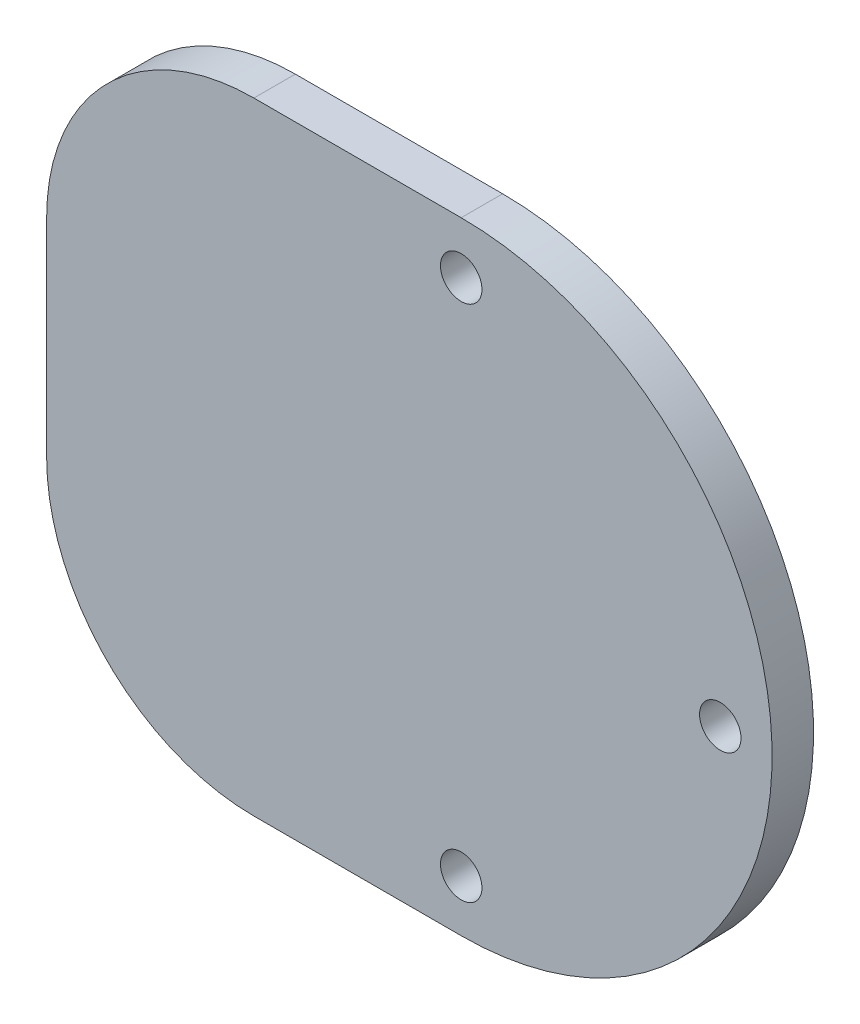
ISO-10303-21;
HEADER;
FILE_DESCRIPTION(('STEP AP214'),'2;1');
FILE_NAME('part.step','',(''),(''),'','','');
FILE_SCHEMA(('AUTOMOTIVE_DESIGN { 1 0 10303 214 1 1 1 1 }'));
ENDSEC;
DATA;
#1=APPLICATION_CONTEXT('core data for automotive mechanical design processes');
#2=APPLICATION_PROTOCOL_DEFINITION('international standard','automotive_design',2000,#1);
#3=PRODUCT_CONTEXT('',#1,'mechanical');
#4=PRODUCT('Part','Part','',(#3));
#5=PRODUCT_RELATED_PRODUCT_CATEGORY('part','',(#4));
#6=PRODUCT_DEFINITION_FORMATION('','',#4);
#7=PRODUCT_DEFINITION_CONTEXT('part definition',#1,'design');
#8=PRODUCT_DEFINITION('design','',#6,#7);
#9=PRODUCT_DEFINITION_SHAPE('','',#8);
#10=(LENGTH_UNIT() NAMED_UNIT(*) SI_UNIT(.MILLI.,.METRE.));
#11=(NAMED_UNIT(*) PLANE_ANGLE_UNIT() SI_UNIT($,.RADIAN.));
#12=(NAMED_UNIT(*) SI_UNIT($,.STERADIAN.) SOLID_ANGLE_UNIT());
#13=UNCERTAINTY_MEASURE_WITH_UNIT(LENGTH_MEASURE(1.E-05),#10,'distance_accuracy_value','');
#14=(GEOMETRIC_REPRESENTATION_CONTEXT(3) GLOBAL_UNCERTAINTY_ASSIGNED_CONTEXT((#13)) GLOBAL_UNIT_ASSIGNED_CONTEXT((#10,
#11,#12)) REPRESENTATION_CONTEXT('',''));
#15=CARTESIAN_POINT('',(0.,0.,0.));
#16=DIRECTION('',(0.,0.,1.));
#17=DIRECTION('',(1.,0.,0.));
#18=AXIS2_PLACEMENT_3D('',#15,#16,#17);
#19=CARTESIAN_POINT('',(0.,0.,10.));
#20=DIRECTION('',(0.,0.,-1.));
#21=DIRECTION('',(-1.,0.,0.));
#22=AXIS2_PLACEMENT_3D('',#19,#20,#21);
#23=CYLINDRICAL_SURFACE('',#22,75.);
#24=CARTESIAN_POINT('',(0.,0.,0.));
#25=DIRECTION('',(0.,0.,1.));
#26=DIRECTION('',(1.,0.,0.));
#27=AXIS2_PLACEMENT_3D('',#24,#25,#26);
#28=CIRCLE('',#27,75.);
#29=CARTESIAN_POINT('',(0.,-75.,0.));
#30=VERTEX_POINT('',#29);
#31=CARTESIAN_POINT('',(0.,75.,0.));
#32=VERTEX_POINT('',#31);
#33=EDGE_CURVE('E105',#30,#32,#28,.T.);
#34=ORIENTED_EDGE('',*,*,#33,.T.);
#35=DIRECTION('',(0.,0.,-1.));
#36=VECTOR('',#35,1.);
#37=CARTESIAN_POINT('',(0.,75.,10.));
#38=LINE('',#37,#36);
#39=CARTESIAN_POINT('',(0.,75.,10.));
#40=VERTEX_POINT('',#39);
#41=EDGE_CURVE('E88',#40,#32,#38,.T.);
#42=ORIENTED_EDGE('',*,*,#41,.F.);
#43=CARTESIAN_POINT('',(0.,0.,10.));
#44=DIRECTION('',(0.,0.,1.));
#45=DIRECTION('',(1.,0.,0.));
#46=AXIS2_PLACEMENT_3D('',#43,#44,#45);
#47=CIRCLE('',#46,75.);
#48=CARTESIAN_POINT('',(0.,-75.,10.));
#49=VERTEX_POINT('',#48);
#50=EDGE_CURVE('E93',#49,#40,#47,.T.);
#51=ORIENTED_EDGE('',*,*,#50,.F.);
#52=DIRECTION('',(0.,0.,-1.));
#53=VECTOR('',#52,1.);
#54=CARTESIAN_POINT('',(0.,-75.,10.));
#55=LINE('',#54,#53);
#56=EDGE_CURVE('E107',#49,#30,#55,.T.);
#57=ORIENTED_EDGE('',*,*,#56,.T.);
#58=EDGE_LOOP('',(#34,#42,#51,#57));
#59=FACE_BOUND('',#58,.T.);
#60=ADVANCED_FACE('F32',(#59),#23,.T.);
#61=CARTESIAN_POINT('',(0.,75.,10.));
#62=DIRECTION('',(0.,-1.,0.));
#63=DIRECTION('',(0.,0.,-1.));
#64=AXIS2_PLACEMENT_3D('',#61,#62,#63);
#65=PLANE('',#64);
#66=DIRECTION('',(-1.,0.,0.));
#67=VECTOR('',#66,1.);
#68=CARTESIAN_POINT('',(0.,75.,0.));
#69=LINE('',#68,#67);
#70=CARTESIAN_POINT('',(-50.,75.,0.));
#71=VERTEX_POINT('',#70);
#72=EDGE_CURVE('E137',#32,#71,#69,.T.);
#73=ORIENTED_EDGE('',*,*,#72,.T.);
#74=DIRECTION('',(0.,0.,-1.));
#75=VECTOR('',#74,1.);
#76=CARTESIAN_POINT('',(-50.,75.,10.));
#77=LINE('',#76,#75);
#78=CARTESIAN_POINT('',(-50.,75.,10.));
#79=VERTEX_POINT('',#78);
#80=EDGE_CURVE('E11',#71,#79,#77,.F.);
#81=ORIENTED_EDGE('',*,*,#80,.T.);
#82=DIRECTION('',(-1.,0.,0.));
#83=VECTOR('',#82,1.);
#84=CARTESIAN_POINT('',(0.,75.,10.));
#85=LINE('',#84,#83);
#86=EDGE_CURVE('E84',#40,#79,#85,.T.);
#87=ORIENTED_EDGE('',*,*,#86,.F.);
#88=ORIENTED_EDGE('',*,*,#41,.T.);
#89=EDGE_LOOP('',(#73,#81,#87,#88));
#90=FACE_BOUND('',#89,.T.);
#91=ADVANCED_FACE('F86',(#90),#65,.F.);
#92=CARTESIAN_POINT('',(-100.,75.,10.));
#93=DIRECTION('',(1.,0.,0.));
#94=DIRECTION('',(0.,0.,-1.));
#95=AXIS2_PLACEMENT_3D('',#92,#93,#94);
#96=PLANE('',#95);
#97=DIRECTION('',(0.,-1.,0.));
#98=VECTOR('',#97,1.);
#99=CARTESIAN_POINT('',(-100.,75.,0.));
#100=LINE('',#99,#98);
#101=CARTESIAN_POINT('',(-100.,25.,0.));
#102=VERTEX_POINT('',#101);
#103=CARTESIAN_POINT('',(-100.,-25.,0.));
#104=VERTEX_POINT('',#103);
#105=EDGE_CURVE('E134',#102,#104,#100,.T.);
#106=ORIENTED_EDGE('',*,*,#105,.T.);
#107=DIRECTION('',(0.,0.,-1.));
#108=VECTOR('',#107,1.);
#109=CARTESIAN_POINT('',(-100.,-25.,10.));
#110=LINE('',#109,#108);
#111=CARTESIAN_POINT('',(-100.,-25.,10.));
#112=VERTEX_POINT('',#111);
#113=EDGE_CURVE('E53',#104,#112,#110,.F.);
#114=ORIENTED_EDGE('',*,*,#113,.T.);
#115=DIRECTION('',(0.,-1.,0.));
#116=VECTOR('',#115,1.);
#117=CARTESIAN_POINT('',(-100.,75.,10.));
#118=LINE('',#117,#116);
#119=CARTESIAN_POINT('',(-100.,25.,10.));
#120=VERTEX_POINT('',#119);
#121=EDGE_CURVE('E92',#120,#112,#118,.T.);
#122=ORIENTED_EDGE('',*,*,#121,.F.);
#123=DIRECTION('',(0.,0.,-1.));
#124=VECTOR('',#123,1.);
#125=CARTESIAN_POINT('',(-100.,25.,10.));
#126=LINE('',#125,#124);
#127=EDGE_CURVE('E118',#120,#102,#126,.T.);
#128=ORIENTED_EDGE('',*,*,#127,.T.);
#129=EDGE_LOOP('',(#106,#114,#122,#128));
#130=FACE_BOUND('',#129,.T.);
#131=ADVANCED_FACE('F135',(#130),#96,.F.);
#132=CARTESIAN_POINT('',(-100.,-75.,10.));
#133=DIRECTION('',(0.,1.,0.));
#134=DIRECTION('',(0.,0.,1.));
#135=AXIS2_PLACEMENT_3D('',#132,#133,#134);
#136=PLANE('',#135);
#137=DIRECTION('',(1.,0.,0.));
#138=VECTOR('',#137,1.);
#139=CARTESIAN_POINT('',(-100.,-75.,10.));
#140=LINE('',#139,#138);
#141=CARTESIAN_POINT('',(-50.,-75.,10.));
#142=VERTEX_POINT('',#141);
#143=EDGE_CURVE('E98',#142,#49,#140,.T.);
#144=ORIENTED_EDGE('',*,*,#143,.F.);
#145=DIRECTION('',(0.,0.,-1.));
#146=VECTOR('',#145,1.);
#147=CARTESIAN_POINT('',(-50.,-75.,10.));
#148=LINE('',#147,#146);
#149=CARTESIAN_POINT('',(-50.,-75.,0.));
#150=VERTEX_POINT('',#149);
#151=EDGE_CURVE('E106',#142,#150,#148,.T.);
#152=ORIENTED_EDGE('',*,*,#151,.T.);
#153=DIRECTION('',(1.,0.,0.));
#154=VECTOR('',#153,1.);
#155=CARTESIAN_POINT('',(-100.,-75.,0.));
#156=LINE('',#155,#154);
#157=EDGE_CURVE('E102',#150,#30,#156,.T.);
#158=ORIENTED_EDGE('',*,*,#157,.T.);
#159=ORIENTED_EDGE('',*,*,#56,.F.);
#160=EDGE_LOOP('',(#144,#152,#158,#159));
#161=FACE_BOUND('',#160,.T.);
#162=ADVANCED_FACE('F127',(#161),#136,.F.);
#163=CARTESIAN_POINT('',(0.,0.,10.));
#164=DIRECTION('',(0.,0.,1.));
#165=DIRECTION('',(1.,0.,0.));
#166=AXIS2_PLACEMENT_3D('',#163,#164,#165);
#167=PLANE('',#166);
#168=CARTESIAN_POINT('',(62.5000000000035,-2.29698647419702E-13,10.));
#169=DIRECTION('',(0.,0.,1.));
#170=DIRECTION('',(1.,0.,0.));
#171=AXIS2_PLACEMENT_3D('',#168,#169,#170);
#172=CIRCLE('',#171,4.99999999999895);
#173=CARTESIAN_POINT('',(67.5000000000025,-2.29698647419702E-13,10.));
#174=VERTEX_POINT('',#173);
#175=EDGE_CURVE('E147',#174,#174,#172,.T.);
#176=ORIENTED_EDGE('',*,*,#175,.F.);
#177=EDGE_LOOP('',(#176));
#178=FACE_BOUND('',#177,.T.);
#179=CARTESIAN_POINT('',(-4.36435167355392E-13,-62.5,10.));
#180=DIRECTION('',(0.,0.,1.));
#181=DIRECTION('',(1.,0.,0.));
#182=AXIS2_PLACEMENT_3D('',#179,#180,#181);
#183=CIRCLE('',#182,5.);
#184=CARTESIAN_POINT('',(4.99999999999957,-62.5,10.));
#185=VERTEX_POINT('',#184);
#186=EDGE_CURVE('E153',#185,#185,#183,.T.);
#187=ORIENTED_EDGE('',*,*,#186,.F.);
#188=EDGE_LOOP('',(#187));
#189=FACE_BOUND('',#188,.T.);
#190=CARTESIAN_POINT('',(0.,62.5,10.));
#191=DIRECTION('',(0.,0.,1.));
#192=DIRECTION('',(1.,0.,0.));
#193=AXIS2_PLACEMENT_3D('',#190,#191,#192);
#194=CIRCLE('',#193,5.);
#195=CARTESIAN_POINT('',(5.,62.5,10.));
#196=VERTEX_POINT('',#195);
#197=EDGE_CURVE('E144',#196,#196,#194,.T.);
#198=ORIENTED_EDGE('',*,*,#197,.F.);
#199=EDGE_LOOP('',(#198));
#200=FACE_BOUND('',#199,.T.);
#201=ORIENTED_EDGE('',*,*,#121,.T.);
#202=CARTESIAN_POINT('',(-50.,-25.,10.));
#203=DIRECTION('',(0.,0.,1.));
#204=DIRECTION('',(1.,0.,0.));
#205=AXIS2_PLACEMENT_3D('',#202,#203,#204);
#206=CIRCLE('',#205,50.);
#207=EDGE_CURVE('E40',#112,#142,#206,.T.);
#208=ORIENTED_EDGE('',*,*,#207,.T.);
#209=ORIENTED_EDGE('',*,*,#143,.T.);
#210=ORIENTED_EDGE('',*,*,#50,.T.);
#211=ORIENTED_EDGE('',*,*,#86,.T.);
#212=CARTESIAN_POINT('',(-50.,25.,10.));
#213=DIRECTION('',(0.,0.,1.));
#214=DIRECTION('',(1.,0.,0.));
#215=AXIS2_PLACEMENT_3D('',#212,#213,#214);
#216=CIRCLE('',#215,50.);
#217=EDGE_CURVE('E122',#79,#120,#216,.T.);
#218=ORIENTED_EDGE('',*,*,#217,.T.);
#219=EDGE_LOOP('',(#201,#208,#209,#210,#211,#218));
#220=FACE_BOUND('',#219,.T.);
#221=ADVANCED_FACE('F96',(#178,#189,#200,#220),#167,.T.);
#222=CARTESIAN_POINT('',(0.,0.,0.));
#223=DIRECTION('',(0.,0.,1.));
#224=DIRECTION('',(1.,0.,0.));
#225=AXIS2_PLACEMENT_3D('',#222,#223,#224);
#226=PLANE('',#225);
#227=CARTESIAN_POINT('',(62.5000000000035,-2.29698647419702E-13,0.));
#228=DIRECTION('',(0.,0.,1.));
#229=DIRECTION('',(1.,0.,0.));
#230=AXIS2_PLACEMENT_3D('',#227,#228,#229);
#231=CIRCLE('',#230,4.99999999999895);
#232=CARTESIAN_POINT('',(67.5000000000025,-2.29698647419702E-13,0.));
#233=VERTEX_POINT('',#232);
#234=EDGE_CURVE('E156',#233,#233,#231,.T.);
#235=ORIENTED_EDGE('',*,*,#234,.T.);
#236=EDGE_LOOP('',(#235));
#237=FACE_BOUND('',#236,.T.);
#238=CARTESIAN_POINT('',(-4.36435167355392E-13,-62.5,0.));
#239=DIRECTION('',(0.,0.,1.));
#240=DIRECTION('',(1.,0.,0.));
#241=AXIS2_PLACEMENT_3D('',#238,#239,#240);
#242=CIRCLE('',#241,5.);
#243=CARTESIAN_POINT('',(4.99999999999957,-62.5,0.));
#244=VERTEX_POINT('',#243);
#245=EDGE_CURVE('E150',#244,#244,#242,.T.);
#246=ORIENTED_EDGE('',*,*,#245,.T.);
#247=EDGE_LOOP('',(#246));
#248=FACE_BOUND('',#247,.T.);
#249=CARTESIAN_POINT('',(0.,62.5,0.));
#250=DIRECTION('',(0.,0.,1.));
#251=DIRECTION('',(1.,0.,0.));
#252=AXIS2_PLACEMENT_3D('',#249,#250,#251);
#253=CIRCLE('',#252,5.);
#254=CARTESIAN_POINT('',(5.,62.5,0.));
#255=VERTEX_POINT('',#254);
#256=EDGE_CURVE('E141',#255,#255,#253,.T.);
#257=ORIENTED_EDGE('',*,*,#256,.T.);
#258=EDGE_LOOP('',(#257));
#259=FACE_BOUND('',#258,.T.);
#260=ORIENTED_EDGE('',*,*,#157,.F.);
#261=CARTESIAN_POINT('',(-50.,-25.,0.));
#262=DIRECTION('',(0.,0.,1.));
#263=DIRECTION('',(1.,0.,0.));
#264=AXIS2_PLACEMENT_3D('',#261,#262,#263);
#265=CIRCLE('',#264,50.);
#266=EDGE_CURVE('E116',#150,#104,#265,.F.);
#267=ORIENTED_EDGE('',*,*,#266,.T.);
#268=ORIENTED_EDGE('',*,*,#105,.F.);
#269=CARTESIAN_POINT('',(-50.,25.,0.));
#270=DIRECTION('',(0.,0.,1.));
#271=DIRECTION('',(1.,0.,0.));
#272=AXIS2_PLACEMENT_3D('',#269,#270,#271);
#273=CIRCLE('',#272,50.);
#274=EDGE_CURVE('E110',#102,#71,#273,.F.);
#275=ORIENTED_EDGE('',*,*,#274,.T.);
#276=ORIENTED_EDGE('',*,*,#72,.F.);
#277=ORIENTED_EDGE('',*,*,#33,.F.);
#278=EDGE_LOOP('',(#260,#267,#268,#275,#276,#277));
#279=FACE_BOUND('',#278,.T.);
#280=ADVANCED_FACE('F133',(#237,#248,#259,#279),#226,.F.);
#281=CARTESIAN_POINT('',(0.,62.5,0.));
#282=DIRECTION('',(0.,0.,1.));
#283=DIRECTION('',(1.,0.,0.));
#284=AXIS2_PLACEMENT_3D('',#281,#282,#283);
#285=CYLINDRICAL_SURFACE('',#284,5.);
#286=ORIENTED_EDGE('',*,*,#256,.F.);
#287=EDGE_LOOP('',(#286));
#288=FACE_BOUND('',#287,.T.);
#289=ORIENTED_EDGE('',*,*,#197,.T.);
#290=EDGE_LOOP('',(#289));
#291=FACE_BOUND('',#290,.T.);
#292=ADVANCED_FACE('F171',(#288,#291),#285,.F.);
#293=CARTESIAN_POINT('',(-4.36435167355392E-13,-62.5,0.));
#294=DIRECTION('',(0.,0.,1.));
#295=DIRECTION('',(1.,0.,0.));
#296=AXIS2_PLACEMENT_3D('',#293,#294,#295);
#297=CYLINDRICAL_SURFACE('',#296,5.);
#298=ORIENTED_EDGE('',*,*,#245,.F.);
#299=EDGE_LOOP('',(#298));
#300=FACE_BOUND('',#299,.T.);
#301=ORIENTED_EDGE('',*,*,#186,.T.);
#302=EDGE_LOOP('',(#301));
#303=FACE_BOUND('',#302,.T.);
#304=ADVANCED_FACE('F173',(#300,#303),#297,.F.);
#305=CARTESIAN_POINT('',(62.5000000000035,-2.29698647419702E-13,0.));
#306=DIRECTION('',(0.,0.,1.));
#307=DIRECTION('',(1.,0.,0.));
#308=AXIS2_PLACEMENT_3D('',#305,#306,#307);
#309=CYLINDRICAL_SURFACE('',#308,4.99999999999895);
#310=ORIENTED_EDGE('',*,*,#234,.F.);
#311=EDGE_LOOP('',(#310));
#312=FACE_BOUND('',#311,.T.);
#313=ORIENTED_EDGE('',*,*,#175,.T.);
#314=EDGE_LOOP('',(#313));
#315=FACE_BOUND('',#314,.T.);
#316=ADVANCED_FACE('F162',(#312,#315),#309,.F.);
#317=CARTESIAN_POINT('',(-50.,-25.,10.));
#318=DIRECTION('',(0.,0.,-1.));
#319=DIRECTION('',(-1.,0.,0.));
#320=AXIS2_PLACEMENT_3D('',#317,#318,#319);
#321=CYLINDRICAL_SURFACE('',#320,50.);
#322=ORIENTED_EDGE('',*,*,#207,.F.);
#323=ORIENTED_EDGE('',*,*,#113,.F.);
#324=ORIENTED_EDGE('',*,*,#266,.F.);
#325=ORIENTED_EDGE('',*,*,#151,.F.);
#326=EDGE_LOOP('',(#322,#323,#324,#325));
#327=FACE_BOUND('',#326,.T.);
#328=ADVANCED_FACE('F130',(#327),#321,.T.);
#329=CARTESIAN_POINT('',(-50.,25.,10.));
#330=DIRECTION('',(0.,0.,-1.));
#331=DIRECTION('',(-1.,0.,0.));
#332=AXIS2_PLACEMENT_3D('',#329,#330,#331);
#333=CYLINDRICAL_SURFACE('',#332,50.);
#334=ORIENTED_EDGE('',*,*,#217,.F.);
#335=ORIENTED_EDGE('',*,*,#80,.F.);
#336=ORIENTED_EDGE('',*,*,#274,.F.);
#337=ORIENTED_EDGE('',*,*,#127,.F.);
#338=EDGE_LOOP('',(#334,#335,#336,#337));
#339=FACE_BOUND('',#338,.T.);
#340=ADVANCED_FACE('F34',(#339),#333,.T.);
#341=CLOSED_SHELL('',(#60,#91,#131,#162,#221,#280,#292,#304,#316,#328,#340));
#342=MANIFOLD_SOLID_BREP('B2',#341);
#343=ADVANCED_BREP_SHAPE_REPRESENTATION('',(#18,#342),#14);
#344=SHAPE_DEFINITION_REPRESENTATION(#9,#343);
ENDSEC;
END-ISO-10303-21;
